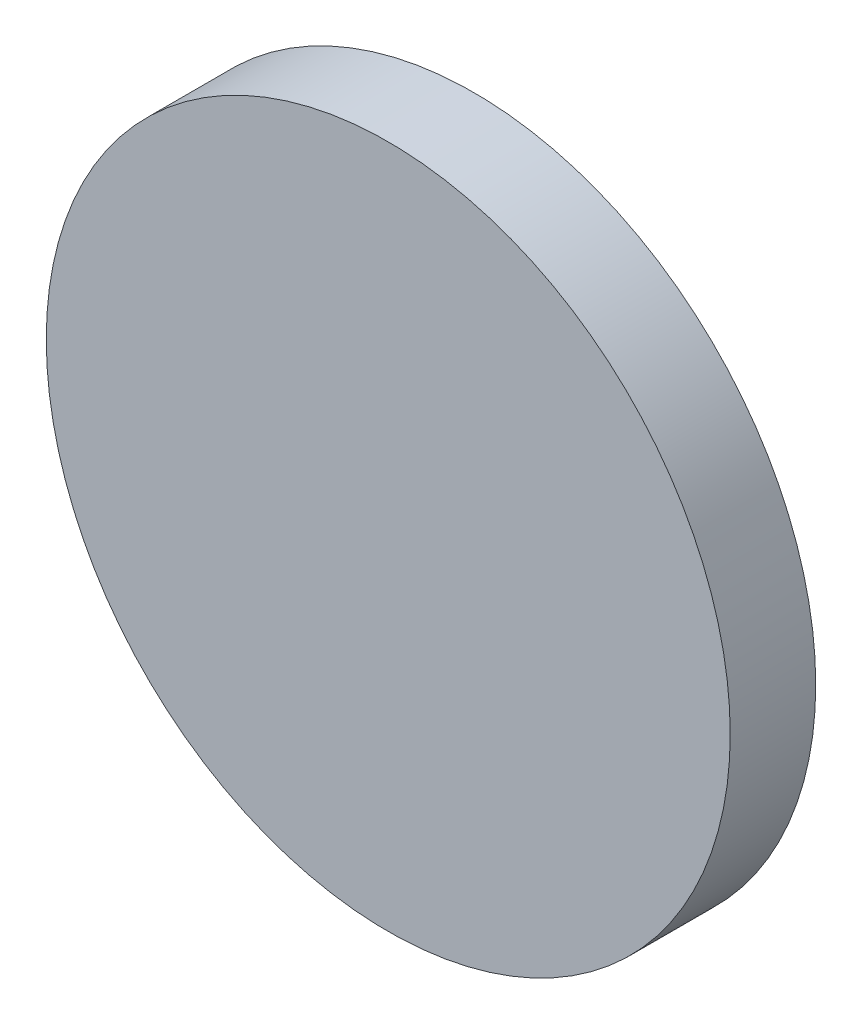
ISO-10303-21;
HEADER;
FILE_DESCRIPTION(('STEP AP214'),'2;1');
FILE_NAME('part.step','',(''),(''),'','','');
FILE_SCHEMA(('AUTOMOTIVE_DESIGN { 1 0 10303 214 1 1 1 1 }'));
ENDSEC;
DATA;
#1=APPLICATION_CONTEXT('core data for automotive mechanical design processes');
#2=APPLICATION_PROTOCOL_DEFINITION('international standard','automotive_design',2000,#1);
#3=PRODUCT_CONTEXT('',#1,'mechanical');
#4=PRODUCT('Part','Part','',(#3));
#5=PRODUCT_RELATED_PRODUCT_CATEGORY('part','',(#4));
#6=PRODUCT_DEFINITION_FORMATION('','',#4);
#7=PRODUCT_DEFINITION_CONTEXT('part definition',#1,'design');
#8=PRODUCT_DEFINITION('design','',#6,#7);
#9=PRODUCT_DEFINITION_SHAPE('','',#8);
#10=(LENGTH_UNIT() NAMED_UNIT(*) SI_UNIT(.MILLI.,.METRE.));
#11=(NAMED_UNIT(*) PLANE_ANGLE_UNIT() SI_UNIT($,.RADIAN.));
#12=(NAMED_UNIT(*) SI_UNIT($,.STERADIAN.) SOLID_ANGLE_UNIT());
#13=UNCERTAINTY_MEASURE_WITH_UNIT(LENGTH_MEASURE(1.E-05),#10,'distance_accuracy_value','');
#14=(GEOMETRIC_REPRESENTATION_CONTEXT(3) GLOBAL_UNCERTAINTY_ASSIGNED_CONTEXT((#13)) GLOBAL_UNIT_ASSIGNED_CONTEXT((#10,
#11,#12)) REPRESENTATION_CONTEXT('',''));
#15=CARTESIAN_POINT('',(0.,0.,0.));
#16=DIRECTION('',(0.,0.,1.));
#17=DIRECTION('',(1.,0.,0.));
#18=AXIS2_PLACEMENT_3D('',#15,#16,#17);
#19=CARTESIAN_POINT('',(0.,0.,6.35));
#20=DIRECTION('',(0.,0.,-1.));
#21=DIRECTION('',(-1.,0.,0.));
#22=AXIS2_PLACEMENT_3D('',#19,#20,#21);
#23=CYLINDRICAL_SURFACE('',#22,25.4);
#24=CARTESIAN_POINT('',(0.,0.,6.35));
#25=DIRECTION('',(0.,0.,1.));
#26=DIRECTION('',(1.,0.,0.));
#27=AXIS2_PLACEMENT_3D('',#24,#25,#26);
#28=CIRCLE('',#27,25.4);
#29=CARTESIAN_POINT('',(25.4,0.,6.35));
#30=VERTEX_POINT('',#29);
#31=EDGE_CURVE('E10',#30,#30,#28,.T.);
#32=ORIENTED_EDGE('',*,*,#31,.F.);
#33=EDGE_LOOP('',(#32));
#34=FACE_BOUND('',#33,.T.);
#35=CARTESIAN_POINT('',(0.,0.,0.));
#36=DIRECTION('',(0.,0.,1.));
#37=DIRECTION('',(1.,0.,0.));
#38=AXIS2_PLACEMENT_3D('',#35,#36,#37);
#39=CIRCLE('',#38,25.4);
#40=CARTESIAN_POINT('',(25.4,0.,0.));
#41=VERTEX_POINT('',#40);
#42=EDGE_CURVE('E40',#41,#41,#39,.T.);
#43=ORIENTED_EDGE('',*,*,#42,.T.);
#44=EDGE_LOOP('',(#43));
#45=FACE_BOUND('',#44,.T.);
#46=ADVANCED_FACE('F37',(#34,#45),#23,.T.);
#47=CARTESIAN_POINT('',(0.,0.,6.35));
#48=DIRECTION('',(0.,0.,1.));
#49=DIRECTION('',(1.,0.,0.));
#50=AXIS2_PLACEMENT_3D('',#47,#48,#49);
#51=PLANE('',#50);
#52=ORIENTED_EDGE('',*,*,#31,.T.);
#53=EDGE_LOOP('',(#52));
#54=FACE_BOUND('',#53,.T.);
#55=ADVANCED_FACE('F54',(#54),#51,.T.);
#56=CARTESIAN_POINT('',(0.,0.,0.));
#57=DIRECTION('',(0.,0.,1.));
#58=DIRECTION('',(1.,0.,0.));
#59=AXIS2_PLACEMENT_3D('',#56,#57,#58);
#60=PLANE('',#59);
#61=ORIENTED_EDGE('',*,*,#42,.F.);
#62=EDGE_LOOP('',(#61));
#63=FACE_BOUND('',#62,.T.);
#64=ADVANCED_FACE('F52',(#63),#60,.F.);
#65=CLOSED_SHELL('',(#46,#55,#64));
#66=MANIFOLD_SOLID_BREP('B2',#65);
#67=ADVANCED_BREP_SHAPE_REPRESENTATION('',(#18,#66),#14);
#68=SHAPE_DEFINITION_REPRESENTATION(#9,#67);
ENDSEC;
END-ISO-10303-21;
